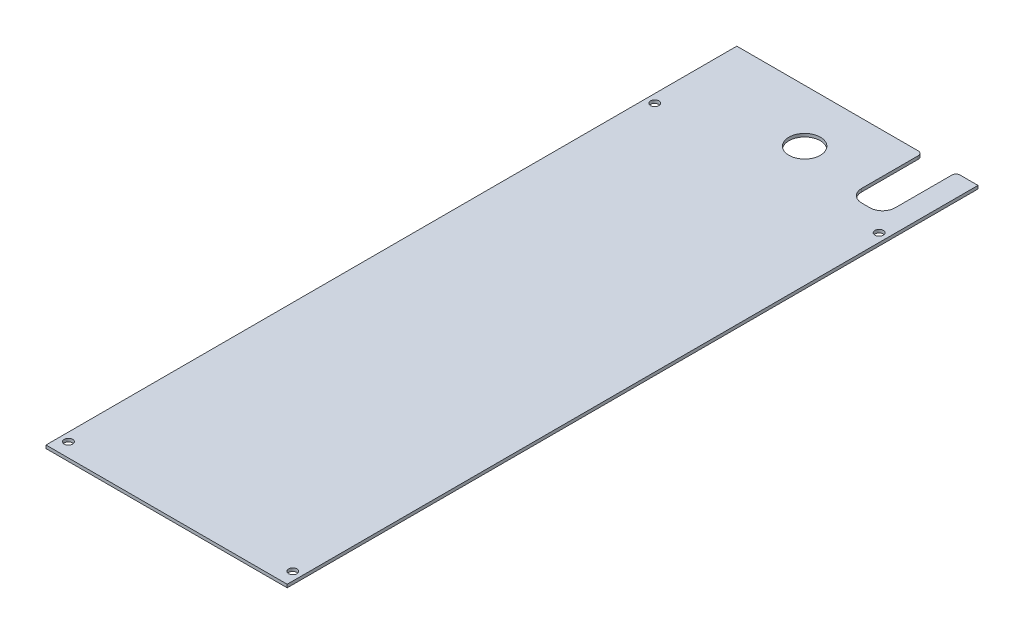
ISO-10303-21;
HEADER;
FILE_DESCRIPTION(('STEP AP214'),'2;1');
FILE_NAME('part.step','',(''),(''),'','','');
FILE_SCHEMA(('AUTOMOTIVE_DESIGN { 1 0 10303 214 1 1 1 1 }'));
ENDSEC;
DATA;
#1=APPLICATION_CONTEXT('core data for automotive mechanical design processes');
#2=APPLICATION_PROTOCOL_DEFINITION('international standard','automotive_design',2000,#1);
#3=PRODUCT_CONTEXT('',#1,'mechanical');
#4=PRODUCT('Part','Part','',(#3));
#5=PRODUCT_RELATED_PRODUCT_CATEGORY('part','',(#4));
#6=PRODUCT_DEFINITION_FORMATION('','',#4);
#7=PRODUCT_DEFINITION_CONTEXT('part definition',#1,'design');
#8=PRODUCT_DEFINITION('design','',#6,#7);
#9=PRODUCT_DEFINITION_SHAPE('','',#8);
#10=(LENGTH_UNIT() NAMED_UNIT(*) SI_UNIT(.MILLI.,.METRE.));
#11=(NAMED_UNIT(*) PLANE_ANGLE_UNIT() SI_UNIT($,.RADIAN.));
#12=(NAMED_UNIT(*) SI_UNIT($,.STERADIAN.) SOLID_ANGLE_UNIT());
#13=UNCERTAINTY_MEASURE_WITH_UNIT(LENGTH_MEASURE(1.E-05),#10,'distance_accuracy_value','');
#14=(GEOMETRIC_REPRESENTATION_CONTEXT(3) GLOBAL_UNCERTAINTY_ASSIGNED_CONTEXT((#13)) GLOBAL_UNIT_ASSIGNED_CONTEXT((#10,
#11,#12)) REPRESENTATION_CONTEXT('',''));
#15=CARTESIAN_POINT('',(0.,0.,0.));
#16=DIRECTION('',(0.,0.,1.));
#17=DIRECTION('',(1.,0.,0.));
#18=AXIS2_PLACEMENT_3D('',#15,#16,#17);
#19=CARTESIAN_POINT('',(-57.5,-1.5,-121.41));
#20=DIRECTION('',(0.,0.,-1.));
#21=DIRECTION('',(-1.,0.,0.));
#22=AXIS2_PLACEMENT_3D('',#19,#20,#21);
#23=PLANE('',#22);
#24=DIRECTION('',(-1.,0.,0.));
#25=VECTOR('',#24,1.);
#26=CARTESIAN_POINT('',(-57.5,0.,-121.41));
#27=LINE('',#26,#25);
#28=CARTESIAN_POINT('',(29.,0.,-121.41));
#29=VERTEX_POINT('',#28);
#30=CARTESIAN_POINT('',(-57.5,0.,-121.41));
#31=VERTEX_POINT('',#30);
#32=EDGE_CURVE('E188',#29,#31,#27,.T.);
#33=ORIENTED_EDGE('',*,*,#32,.F.);
#34=DIRECTION('',(0.,1.,0.));
#35=VECTOR('',#34,1.);
#36=CARTESIAN_POINT('',(29.,-1.5,-121.41));
#37=LINE('',#36,#35);
#38=CARTESIAN_POINT('',(29.,-1.5,-121.41));
#39=VERTEX_POINT('',#38);
#40=EDGE_CURVE('E13',#29,#39,#37,.F.);
#41=ORIENTED_EDGE('',*,*,#40,.T.);
#42=DIRECTION('',(-1.,0.,0.));
#43=VECTOR('',#42,1.);
#44=CARTESIAN_POINT('',(-57.5,-1.5,-121.41));
#45=LINE('',#44,#43);
#46=CARTESIAN_POINT('',(-57.5,-1.5,-121.41));
#47=VERTEX_POINT('',#46);
#48=EDGE_CURVE('E170',#39,#47,#45,.T.);
#49=ORIENTED_EDGE('',*,*,#48,.T.);
#50=DIRECTION('',(0.,1.,0.));
#51=VECTOR('',#50,1.);
#52=CARTESIAN_POINT('',(-57.5,-1.5,-121.41));
#53=LINE('',#52,#51);
#54=EDGE_CURVE('E157',#47,#31,#53,.T.);
#55=ORIENTED_EDGE('',*,*,#54,.T.);
#56=EDGE_LOOP('',(#33,#41,#49,#55));
#57=FACE_BOUND('',#56,.T.);
#58=ADVANCED_FACE('F57',(#57),#23,.T.);
#59=CARTESIAN_POINT('',(57.5,-1.5,207.99));
#60=DIRECTION('',(1.,0.,0.));
#61=DIRECTION('',(0.,0.,-1.));
#62=AXIS2_PLACEMENT_3D('',#59,#60,#61);
#63=PLANE('',#62);
#64=DIRECTION('',(0.,0.,-1.));
#65=VECTOR('',#64,1.);
#66=CARTESIAN_POINT('',(57.5,0.,207.99));
#67=LINE('',#66,#65);
#68=CARTESIAN_POINT('',(57.5,0.,207.99));
#69=VERTEX_POINT('',#68);
#70=CARTESIAN_POINT('',(57.5,0.,-121.41));
#71=VERTEX_POINT('',#70);
#72=EDGE_CURVE('E186',#69,#71,#67,.T.);
#73=ORIENTED_EDGE('',*,*,#72,.F.);
#74=DIRECTION('',(0.,1.,0.));
#75=VECTOR('',#74,1.);
#76=CARTESIAN_POINT('',(57.5,-1.5,207.99));
#77=LINE('',#76,#75);
#78=CARTESIAN_POINT('',(57.5,-1.5,207.99));
#79=VERTEX_POINT('',#78);
#80=EDGE_CURVE('E173',#79,#69,#77,.T.);
#81=ORIENTED_EDGE('',*,*,#80,.F.);
#82=DIRECTION('',(0.,0.,-1.));
#83=VECTOR('',#82,1.);
#84=CARTESIAN_POINT('',(57.5,-1.5,207.99));
#85=LINE('',#84,#83);
#86=CARTESIAN_POINT('',(57.5,-1.5,-121.41));
#87=VERTEX_POINT('',#86);
#88=EDGE_CURVE('E165',#79,#87,#85,.T.);
#89=ORIENTED_EDGE('',*,*,#88,.T.);
#90=DIRECTION('',(0.,1.,0.));
#91=VECTOR('',#90,1.);
#92=CARTESIAN_POINT('',(57.5,-1.5,-121.41));
#93=LINE('',#92,#91);
#94=EDGE_CURVE('E145',#87,#71,#93,.T.);
#95=ORIENTED_EDGE('',*,*,#94,.T.);
#96=EDGE_LOOP('',(#73,#81,#89,#95));
#97=FACE_BOUND('',#96,.T.);
#98=ADVANCED_FACE('F172',(#97),#63,.T.);
#99=CARTESIAN_POINT('',(-57.5,-1.5,207.99));
#100=DIRECTION('',(0.,0.,1.));
#101=DIRECTION('',(1.,0.,0.));
#102=AXIS2_PLACEMENT_3D('',#99,#100,#101);
#103=PLANE('',#102);
#104=DIRECTION('',(1.,0.,0.));
#105=VECTOR('',#104,1.);
#106=CARTESIAN_POINT('',(-57.5,0.,207.99));
#107=LINE('',#106,#105);
#108=CARTESIAN_POINT('',(-57.5,0.,207.99));
#109=VERTEX_POINT('',#108);
#110=EDGE_CURVE('E174',#109,#69,#107,.T.);
#111=ORIENTED_EDGE('',*,*,#110,.F.);
#112=DIRECTION('',(0.,1.,0.));
#113=VECTOR('',#112,1.);
#114=CARTESIAN_POINT('',(-57.5,-1.5,207.99));
#115=LINE('',#114,#113);
#116=CARTESIAN_POINT('',(-57.5,-1.5,207.99));
#117=VERTEX_POINT('',#116);
#118=EDGE_CURVE('E195',#117,#109,#115,.T.);
#119=ORIENTED_EDGE('',*,*,#118,.F.);
#120=DIRECTION('',(1.,0.,0.));
#121=VECTOR('',#120,1.);
#122=CARTESIAN_POINT('',(-57.5,-1.5,207.99));
#123=LINE('',#122,#121);
#124=EDGE_CURVE('E158',#117,#79,#123,.T.);
#125=ORIENTED_EDGE('',*,*,#124,.T.);
#126=ORIENTED_EDGE('',*,*,#80,.T.);
#127=EDGE_LOOP('',(#111,#119,#125,#126));
#128=FACE_BOUND('',#127,.T.);
#129=ADVANCED_FACE('F299',(#128),#103,.T.);
#130=CARTESIAN_POINT('',(-57.5,-1.5,207.99));
#131=DIRECTION('',(-1.,0.,0.));
#132=DIRECTION('',(0.,0.,1.));
#133=AXIS2_PLACEMENT_3D('',#130,#131,#132);
#134=PLANE('',#133);
#135=DIRECTION('',(0.,0.,1.));
#136=VECTOR('',#135,1.);
#137=CARTESIAN_POINT('',(-57.5,0.,207.99));
#138=LINE('',#137,#136);
#139=EDGE_CURVE('E177',#31,#109,#138,.T.);
#140=ORIENTED_EDGE('',*,*,#139,.F.);
#141=ORIENTED_EDGE('',*,*,#54,.F.);
#142=DIRECTION('',(0.,0.,1.));
#143=VECTOR('',#142,1.);
#144=CARTESIAN_POINT('',(-57.5,-1.5,207.99));
#145=LINE('',#144,#143);
#146=EDGE_CURVE('E169',#47,#117,#145,.T.);
#147=ORIENTED_EDGE('',*,*,#146,.T.);
#148=ORIENTED_EDGE('',*,*,#118,.T.);
#149=EDGE_LOOP('',(#140,#141,#147,#148));
#150=FACE_BOUND('',#149,.T.);
#151=ADVANCED_FACE('F303',(#150),#134,.T.);
#152=CARTESIAN_POINT('',(49.,-1.5,-121.41));
#153=VERTEX_POINT('',#152);
#154=EDGE_CURVE('E149',#87,#153,#45,.T.);
#155=ORIENTED_EDGE('',*,*,#154,.T.);
#156=DIRECTION('',(0.,1.,0.));
#157=VECTOR('',#156,1.);
#158=CARTESIAN_POINT('',(49.,0.,-121.41));
#159=LINE('',#158,#157);
#160=CARTESIAN_POINT('',(49.,0.,-121.41));
#161=VERTEX_POINT('',#160);
#162=EDGE_CURVE('E218',#153,#161,#159,.T.);
#163=ORIENTED_EDGE('',*,*,#162,.T.);
#164=EDGE_CURVE('E152',#71,#161,#27,.T.);
#165=ORIENTED_EDGE('',*,*,#164,.F.);
#166=ORIENTED_EDGE('',*,*,#94,.F.);
#167=EDGE_LOOP('',(#155,#163,#165,#166));
#168=FACE_BOUND('',#167,.T.);
#169=ADVANCED_FACE('F147',(#168),#23,.T.);
#170=CARTESIAN_POINT('',(0.,-1.5,0.));
#171=DIRECTION('',(0.,-1.,0.));
#172=DIRECTION('',(0.,0.,-1.));
#173=AXIS2_PLACEMENT_3D('',#170,#171,#172);
#174=PLANE('',#173);
#175=DIRECTION('',(0.,0.,-1.));
#176=VECTOR('',#175,1.);
#177=CARTESIAN_POINT('',(47.,-1.5,-121.41));
#178=LINE('',#177,#176);
#179=CARTESIAN_POINT('',(47.,-1.5,-92.41));
#180=VERTEX_POINT('',#179);
#181=CARTESIAN_POINT('',(47.,-1.5,-119.41));
#182=VERTEX_POINT('',#181);
#183=EDGE_CURVE('E245',#180,#182,#178,.T.);
#184=ORIENTED_EDGE('',*,*,#183,.T.);
#185=CARTESIAN_POINT('',(49.,-1.5,-119.41));
#186=DIRECTION('',(0.,-1.,0.));
#187=DIRECTION('',(0.,0.,-1.));
#188=AXIS2_PLACEMENT_3D('',#185,#186,#187);
#189=CIRCLE('',#188,2.);
#190=EDGE_CURVE('E168',#182,#153,#189,.T.);
#191=ORIENTED_EDGE('',*,*,#190,.T.);
#192=ORIENTED_EDGE('',*,*,#154,.F.);
#193=ORIENTED_EDGE('',*,*,#88,.F.);
#194=ORIENTED_EDGE('',*,*,#124,.F.);
#195=ORIENTED_EDGE('',*,*,#146,.F.);
#196=ORIENTED_EDGE('',*,*,#48,.F.);
#197=CARTESIAN_POINT('',(29.,-1.5,-119.41));
#198=DIRECTION('',(0.,-1.,0.));
#199=DIRECTION('',(0.,0.,-1.));
#200=AXIS2_PLACEMENT_3D('',#197,#198,#199);
#201=CIRCLE('',#200,2.);
#202=CARTESIAN_POINT('',(31.,-1.5,-119.41));
#203=VERTEX_POINT('',#202);
#204=EDGE_CURVE('E77',#39,#203,#201,.T.);
#205=ORIENTED_EDGE('',*,*,#204,.T.);
#206=DIRECTION('',(0.,0.,1.));
#207=VECTOR('',#206,1.);
#208=CARTESIAN_POINT('',(31.,-1.5,-121.41));
#209=LINE('',#208,#207);
#210=CARTESIAN_POINT('',(31.,-1.5,-92.41));
#211=VERTEX_POINT('',#210);
#212=EDGE_CURVE('E233',#203,#211,#209,.T.);
#213=ORIENTED_EDGE('',*,*,#212,.T.);
#214=CARTESIAN_POINT('',(37.,-1.5,-92.41));
#215=DIRECTION('',(0.,-1.,0.));
#216=DIRECTION('',(0.,0.,-1.));
#217=AXIS2_PLACEMENT_3D('',#214,#215,#216);
#218=CIRCLE('',#217,6.);
#219=CARTESIAN_POINT('',(37.,-1.5,-86.41));
#220=VERTEX_POINT('',#219);
#221=EDGE_CURVE('E216',#211,#220,#218,.F.);
#222=ORIENTED_EDGE('',*,*,#221,.T.);
#223=DIRECTION('',(1.,0.,0.));
#224=VECTOR('',#223,1.);
#225=CARTESIAN_POINT('',(31.,-1.5,-86.41));
#226=LINE('',#225,#224);
#227=CARTESIAN_POINT('',(41.,-1.5,-86.41));
#228=VERTEX_POINT('',#227);
#229=EDGE_CURVE('E348',#220,#228,#226,.T.);
#230=ORIENTED_EDGE('',*,*,#229,.T.);
#231=CARTESIAN_POINT('',(41.,-1.5,-92.41));
#232=DIRECTION('',(0.,-1.,0.));
#233=DIRECTION('',(0.,0.,-1.));
#234=AXIS2_PLACEMENT_3D('',#231,#232,#233);
#235=CIRCLE('',#234,6.);
#236=EDGE_CURVE('E211',#228,#180,#235,.F.);
#237=ORIENTED_EDGE('',*,*,#236,.T.);
#238=EDGE_LOOP('',(#184,#191,#192,#193,#194,#195,#196,#205,#213,#222,#230,#237));
#239=FACE_BOUND('',#238,.T.);
#240=CARTESIAN_POINT('',(0.,-1.5,-96.25));
#241=DIRECTION('',(0.,-1.,0.));
#242=DIRECTION('',(0.,0.,-1.));
#243=AXIS2_PLACEMENT_3D('',#240,#241,#242);
#244=CIRCLE('',#243,7.5);
#245=CARTESIAN_POINT('',(0.,-1.5,-103.75));
#246=VERTEX_POINT('',#245);
#247=EDGE_CURVE('E254',#246,#246,#244,.F.);
#248=ORIENTED_EDGE('',*,*,#247,.T.);
#249=EDGE_LOOP('',(#248));
#250=FACE_BOUND('',#249,.T.);
#251=CARTESIAN_POINT('',(53.5000000000001,-1.5,201.3));
#252=DIRECTION('',(0.,-1.,0.));
#253=DIRECTION('',(0.,0.,-1.));
#254=AXIS2_PLACEMENT_3D('',#251,#252,#253);
#255=CIRCLE('',#254,2.);
#256=CARTESIAN_POINT('',(53.5000000000001,-1.5,199.3));
#257=VERTEX_POINT('',#256);
#258=EDGE_CURVE('E253',#257,#257,#255,.F.);
#259=ORIENTED_EDGE('',*,*,#258,.T.);
#260=EDGE_LOOP('',(#259));
#261=FACE_BOUND('',#260,.T.);
#262=CARTESIAN_POINT('',(53.5,-1.5,-78.2599999999999));
#263=DIRECTION('',(0.,-1.,0.));
#264=DIRECTION('',(0.,0.,-1.));
#265=AXIS2_PLACEMENT_3D('',#262,#263,#264);
#266=CIRCLE('',#265,2.);
#267=CARTESIAN_POINT('',(53.5,-1.5,-80.26));
#268=VERTEX_POINT('',#267);
#269=EDGE_CURVE('E260',#268,#268,#266,.F.);
#270=ORIENTED_EDGE('',*,*,#269,.T.);
#271=EDGE_LOOP('',(#270));
#272=FACE_BOUND('',#271,.T.);
#273=CARTESIAN_POINT('',(-53.5,-1.5,-78.2599999999999));
#274=DIRECTION('',(0.,-1.,0.));
#275=DIRECTION('',(0.,0.,-1.));
#276=AXIS2_PLACEMENT_3D('',#273,#274,#275);
#277=CIRCLE('',#276,2.);
#278=CARTESIAN_POINT('',(-53.5,-1.5,-80.2599999999999));
#279=VERTEX_POINT('',#278);
#280=EDGE_CURVE('E266',#279,#279,#277,.F.);
#281=ORIENTED_EDGE('',*,*,#280,.T.);
#282=EDGE_LOOP('',(#281));
#283=FACE_BOUND('',#282,.T.);
#284=CARTESIAN_POINT('',(-53.5,-1.5,201.3));
#285=DIRECTION('',(0.,-1.,0.));
#286=DIRECTION('',(0.,0.,-1.));
#287=AXIS2_PLACEMENT_3D('',#284,#285,#286);
#288=CIRCLE('',#287,2.);
#289=CARTESIAN_POINT('',(-53.5,-1.5,199.3));
#290=VERTEX_POINT('',#289);
#291=EDGE_CURVE('E180',#290,#290,#288,.F.);
#292=ORIENTED_EDGE('',*,*,#291,.T.);
#293=EDGE_LOOP('',(#292));
#294=FACE_BOUND('',#293,.T.);
#295=ADVANCED_FACE('F162',(#239,#250,#261,#272,#283,#294),#174,.T.);
#296=CARTESIAN_POINT('',(0.,0.,0.));
#297=DIRECTION('',(0.,-1.,0.));
#298=DIRECTION('',(0.,0.,-1.));
#299=AXIS2_PLACEMENT_3D('',#296,#297,#298);
#300=PLANE('',#299);
#301=CARTESIAN_POINT('',(0.,0.,-96.25));
#302=DIRECTION('',(0.,1.,0.));
#303=DIRECTION('',(0.,0.,1.));
#304=AXIS2_PLACEMENT_3D('',#301,#302,#303);
#305=CIRCLE('',#304,7.5);
#306=CARTESIAN_POINT('',(0.,0.,-88.75));
#307=VERTEX_POINT('',#306);
#308=EDGE_CURVE('E250',#307,#307,#305,.T.);
#309=ORIENTED_EDGE('',*,*,#308,.F.);
#310=EDGE_LOOP('',(#309));
#311=FACE_BOUND('',#310,.T.);
#312=CARTESIAN_POINT('',(53.5000000000001,0.,201.3));
#313=DIRECTION('',(0.,1.,0.));
#314=DIRECTION('',(0.,0.,-1.));
#315=AXIS2_PLACEMENT_3D('',#312,#313,#314);
#316=CIRCLE('',#315,2.);
#317=CARTESIAN_POINT('',(53.5000000000001,0.,199.3));
#318=VERTEX_POINT('',#317);
#319=EDGE_CURVE('E257',#318,#318,#316,.T.);
#320=ORIENTED_EDGE('',*,*,#319,.F.);
#321=EDGE_LOOP('',(#320));
#322=FACE_BOUND('',#321,.T.);
#323=CARTESIAN_POINT('',(53.5,0.,-78.2599999999999));
#324=DIRECTION('',(0.,1.,0.));
#325=DIRECTION('',(0.,0.,-1.));
#326=AXIS2_PLACEMENT_3D('',#323,#324,#325);
#327=CIRCLE('',#326,2.);
#328=CARTESIAN_POINT('',(53.5,0.,-80.26));
#329=VERTEX_POINT('',#328);
#330=EDGE_CURVE('E263',#329,#329,#327,.T.);
#331=ORIENTED_EDGE('',*,*,#330,.F.);
#332=EDGE_LOOP('',(#331));
#333=FACE_BOUND('',#332,.T.);
#334=CARTESIAN_POINT('',(-53.5,0.,-78.2599999999999));
#335=DIRECTION('',(0.,1.,0.));
#336=DIRECTION('',(0.,0.,1.));
#337=AXIS2_PLACEMENT_3D('',#334,#335,#336);
#338=CIRCLE('',#337,2.);
#339=CARTESIAN_POINT('',(-53.5,0.,-76.2599999999999));
#340=VERTEX_POINT('',#339);
#341=EDGE_CURVE('E269',#340,#340,#338,.T.);
#342=ORIENTED_EDGE('',*,*,#341,.F.);
#343=EDGE_LOOP('',(#342));
#344=FACE_BOUND('',#343,.T.);
#345=CARTESIAN_POINT('',(-53.5,0.,201.3));
#346=DIRECTION('',(0.,1.,0.));
#347=DIRECTION('',(0.,0.,1.));
#348=AXIS2_PLACEMENT_3D('',#345,#346,#347);
#349=CIRCLE('',#348,2.);
#350=CARTESIAN_POINT('',(-53.5,0.,203.3));
#351=VERTEX_POINT('',#350);
#352=EDGE_CURVE('E189',#351,#351,#349,.T.);
#353=ORIENTED_EDGE('',*,*,#352,.F.);
#354=EDGE_LOOP('',(#353));
#355=FACE_BOUND('',#354,.T.);
#356=ORIENTED_EDGE('',*,*,#164,.T.);
#357=CARTESIAN_POINT('',(49.,0.,-119.41));
#358=DIRECTION('',(0.,-1.,0.));
#359=DIRECTION('',(0.,0.,-1.));
#360=AXIS2_PLACEMENT_3D('',#357,#358,#359);
#361=CIRCLE('',#360,2.);
#362=CARTESIAN_POINT('',(47.,0.,-119.41));
#363=VERTEX_POINT('',#362);
#364=EDGE_CURVE('E222',#161,#363,#361,.F.);
#365=ORIENTED_EDGE('',*,*,#364,.T.);
#366=DIRECTION('',(0.,0.,-1.));
#367=VECTOR('',#366,1.);
#368=CARTESIAN_POINT('',(47.,0.,-121.41));
#369=LINE('',#368,#367);
#370=CARTESIAN_POINT('',(47.,0.,-92.41));
#371=VERTEX_POINT('',#370);
#372=EDGE_CURVE('E242',#371,#363,#369,.T.);
#373=ORIENTED_EDGE('',*,*,#372,.F.);
#374=CARTESIAN_POINT('',(41.,0.,-92.41));
#375=DIRECTION('',(0.,-1.,0.));
#376=DIRECTION('',(0.,0.,-1.));
#377=AXIS2_PLACEMENT_3D('',#374,#375,#376);
#378=CIRCLE('',#377,6.);
#379=CARTESIAN_POINT('',(41.,0.,-86.41));
#380=VERTEX_POINT('',#379);
#381=EDGE_CURVE('E209',#371,#380,#378,.T.);
#382=ORIENTED_EDGE('',*,*,#381,.T.);
#383=DIRECTION('',(1.,0.,0.));
#384=VECTOR('',#383,1.);
#385=CARTESIAN_POINT('',(31.,0.,-86.41));
#386=LINE('',#385,#384);
#387=CARTESIAN_POINT('',(37.,0.,-86.41));
#388=VERTEX_POINT('',#387);
#389=EDGE_CURVE('E239',#388,#380,#386,.T.);
#390=ORIENTED_EDGE('',*,*,#389,.F.);
#391=CARTESIAN_POINT('',(37.,0.,-92.41));
#392=DIRECTION('',(0.,-1.,0.));
#393=DIRECTION('',(0.,0.,-1.));
#394=AXIS2_PLACEMENT_3D('',#391,#392,#393);
#395=CIRCLE('',#394,6.);
#396=CARTESIAN_POINT('',(31.,0.,-92.41));
#397=VERTEX_POINT('',#396);
#398=EDGE_CURVE('E213',#388,#397,#395,.T.);
#399=ORIENTED_EDGE('',*,*,#398,.T.);
#400=DIRECTION('',(0.,0.,1.));
#401=VECTOR('',#400,1.);
#402=CARTESIAN_POINT('',(31.,0.,-121.41));
#403=LINE('',#402,#401);
#404=CARTESIAN_POINT('',(31.,0.,-119.41));
#405=VERTEX_POINT('',#404);
#406=EDGE_CURVE('E232',#405,#397,#403,.T.);
#407=ORIENTED_EDGE('',*,*,#406,.F.);
#408=CARTESIAN_POINT('',(29.,0.,-119.41));
#409=DIRECTION('',(0.,-1.,0.));
#410=DIRECTION('',(0.,0.,-1.));
#411=AXIS2_PLACEMENT_3D('',#408,#409,#410);
#412=CIRCLE('',#411,2.);
#413=EDGE_CURVE('E220',#405,#29,#412,.F.);
#414=ORIENTED_EDGE('',*,*,#413,.T.);
#415=ORIENTED_EDGE('',*,*,#32,.T.);
#416=ORIENTED_EDGE('',*,*,#139,.T.);
#417=ORIENTED_EDGE('',*,*,#110,.T.);
#418=ORIENTED_EDGE('',*,*,#72,.T.);
#419=EDGE_LOOP('',(#356,#365,#373,#382,#390,#399,#407,#414,#415,#416,#417,#418));
#420=FACE_BOUND('',#419,.T.);
#421=ADVANCED_FACE('F236',(#311,#322,#333,#344,#355,#420),#300,.F.);
#422=CARTESIAN_POINT('',(-53.5,-1.501,201.3));
#423=DIRECTION('',(0.,1.,0.));
#424=DIRECTION('',(0.,0.,1.));
#425=AXIS2_PLACEMENT_3D('',#422,#423,#424);
#426=CYLINDRICAL_SURFACE('',#425,2.);
#427=ORIENTED_EDGE('',*,*,#291,.F.);
#428=EDGE_LOOP('',(#427));
#429=FACE_BOUND('',#428,.T.);
#430=ORIENTED_EDGE('',*,*,#352,.T.);
#431=EDGE_LOOP('',(#430));
#432=FACE_BOUND('',#431,.T.);
#433=ADVANCED_FACE('F280',(#429,#432),#426,.F.);
#434=CARTESIAN_POINT('',(-53.5,-1.501,-78.2599999999999));
#435=DIRECTION('',(0.,1.,0.));
#436=DIRECTION('',(0.,0.,1.));
#437=AXIS2_PLACEMENT_3D('',#434,#435,#436);
#438=CYLINDRICAL_SURFACE('',#437,2.);
#439=ORIENTED_EDGE('',*,*,#280,.F.);
#440=EDGE_LOOP('',(#439));
#441=FACE_BOUND('',#440,.T.);
#442=ORIENTED_EDGE('',*,*,#341,.T.);
#443=EDGE_LOOP('',(#442));
#444=FACE_BOUND('',#443,.T.);
#445=ADVANCED_FACE('F282',(#441,#444),#438,.F.);
#446=CARTESIAN_POINT('',(53.5,-1.501,-78.2599999999999));
#447=DIRECTION('',(0.,1.,0.));
#448=DIRECTION('',(0.,0.,1.));
#449=AXIS2_PLACEMENT_3D('',#446,#447,#448);
#450=CYLINDRICAL_SURFACE('',#449,2.);
#451=ORIENTED_EDGE('',*,*,#269,.F.);
#452=EDGE_LOOP('',(#451));
#453=FACE_BOUND('',#452,.T.);
#454=ORIENTED_EDGE('',*,*,#330,.T.);
#455=EDGE_LOOP('',(#454));
#456=FACE_BOUND('',#455,.T.);
#457=ADVANCED_FACE('F288',(#453,#456),#450,.F.);
#458=CARTESIAN_POINT('',(53.5000000000001,-1.501,201.3));
#459=DIRECTION('',(0.,1.,0.));
#460=DIRECTION('',(0.,0.,1.));
#461=AXIS2_PLACEMENT_3D('',#458,#459,#460);
#462=CYLINDRICAL_SURFACE('',#461,2.);
#463=ORIENTED_EDGE('',*,*,#258,.F.);
#464=EDGE_LOOP('',(#463));
#465=FACE_BOUND('',#464,.T.);
#466=ORIENTED_EDGE('',*,*,#319,.T.);
#467=EDGE_LOOP('',(#466));
#468=FACE_BOUND('',#467,.T.);
#469=ADVANCED_FACE('F362',(#465,#468),#462,.F.);
#470=CARTESIAN_POINT('',(0.,-1.501,-96.25));
#471=DIRECTION('',(0.,1.,0.));
#472=DIRECTION('',(0.,0.,1.));
#473=AXIS2_PLACEMENT_3D('',#470,#471,#472);
#474=CYLINDRICAL_SURFACE('',#473,7.5);
#475=ORIENTED_EDGE('',*,*,#247,.F.);
#476=EDGE_LOOP('',(#475));
#477=FACE_BOUND('',#476,.T.);
#478=ORIENTED_EDGE('',*,*,#308,.T.);
#479=EDGE_LOOP('',(#478));
#480=FACE_BOUND('',#479,.T.);
#481=ADVANCED_FACE('F359',(#477,#480),#474,.F.);
#482=CARTESIAN_POINT('',(31.,-1.5,-121.41));
#483=DIRECTION('',(-1.,0.,0.));
#484=DIRECTION('',(0.,0.,1.));
#485=AXIS2_PLACEMENT_3D('',#482,#483,#484);
#486=PLANE('',#485);
#487=ORIENTED_EDGE('',*,*,#212,.F.);
#488=DIRECTION('',(0.,1.,0.));
#489=VECTOR('',#488,1.);
#490=CARTESIAN_POINT('',(31.,0.,-119.41));
#491=LINE('',#490,#489);
#492=EDGE_CURVE('E65',#203,#405,#491,.T.);
#493=ORIENTED_EDGE('',*,*,#492,.T.);
#494=ORIENTED_EDGE('',*,*,#406,.T.);
#495=DIRECTION('',(0.,1.,0.));
#496=VECTOR('',#495,1.);
#497=CARTESIAN_POINT('',(31.,-1.5,-92.41));
#498=LINE('',#497,#496);
#499=EDGE_CURVE('E206',#397,#211,#498,.F.);
#500=ORIENTED_EDGE('',*,*,#499,.T.);
#501=EDGE_LOOP('',(#487,#493,#494,#500));
#502=FACE_BOUND('',#501,.T.);
#503=ADVANCED_FACE('F231',(#502),#486,.F.);
#504=CARTESIAN_POINT('',(47.,-1.5,-121.41));
#505=DIRECTION('',(1.,0.,0.));
#506=DIRECTION('',(0.,0.,-1.));
#507=AXIS2_PLACEMENT_3D('',#504,#505,#506);
#508=PLANE('',#507);
#509=ORIENTED_EDGE('',*,*,#372,.T.);
#510=DIRECTION('',(0.,1.,0.));
#511=VECTOR('',#510,1.);
#512=CARTESIAN_POINT('',(47.,-1.5,-119.41));
#513=LINE('',#512,#511);
#514=EDGE_CURVE('E224',#363,#182,#513,.F.);
#515=ORIENTED_EDGE('',*,*,#514,.T.);
#516=ORIENTED_EDGE('',*,*,#183,.F.);
#517=DIRECTION('',(0.,1.,0.));
#518=VECTOR('',#517,1.);
#519=CARTESIAN_POINT('',(47.,0.,-92.41));
#520=LINE('',#519,#518);
#521=EDGE_CURVE('E194',#180,#371,#520,.T.);
#522=ORIENTED_EDGE('',*,*,#521,.T.);
#523=EDGE_LOOP('',(#509,#515,#516,#522));
#524=FACE_BOUND('',#523,.T.);
#525=ADVANCED_FACE('F322',(#524),#508,.F.);
#526=CARTESIAN_POINT('',(31.,-1.5,-86.41));
#527=DIRECTION('',(0.,0.,1.));
#528=DIRECTION('',(1.,0.,0.));
#529=AXIS2_PLACEMENT_3D('',#526,#527,#528);
#530=PLANE('',#529);
#531=ORIENTED_EDGE('',*,*,#389,.T.);
#532=DIRECTION('',(0.,1.,0.));
#533=VECTOR('',#532,1.);
#534=CARTESIAN_POINT('',(41.,-1.5,-86.41));
#535=LINE('',#534,#533);
#536=EDGE_CURVE('E204',#380,#228,#535,.F.);
#537=ORIENTED_EDGE('',*,*,#536,.T.);
#538=ORIENTED_EDGE('',*,*,#229,.F.);
#539=DIRECTION('',(0.,1.,0.));
#540=VECTOR('',#539,1.);
#541=CARTESIAN_POINT('',(37.,0.,-86.41));
#542=LINE('',#541,#540);
#543=EDGE_CURVE('E201',#220,#388,#542,.T.);
#544=ORIENTED_EDGE('',*,*,#543,.T.);
#545=EDGE_LOOP('',(#531,#537,#538,#544));
#546=FACE_BOUND('',#545,.T.);
#547=ADVANCED_FACE('F337',(#546),#530,.F.);
#548=CARTESIAN_POINT('',(41.,-1.5,-92.41));
#549=DIRECTION('',(0.,-1.,0.));
#550=DIRECTION('',(0.,0.,-1.));
#551=AXIS2_PLACEMENT_3D('',#548,#549,#550);
#552=CYLINDRICAL_SURFACE('',#551,6.);
#553=ORIENTED_EDGE('',*,*,#236,.F.);
#554=ORIENTED_EDGE('',*,*,#536,.F.);
#555=ORIENTED_EDGE('',*,*,#381,.F.);
#556=ORIENTED_EDGE('',*,*,#521,.F.);
#557=EDGE_LOOP('',(#553,#554,#555,#556));
#558=FACE_BOUND('',#557,.T.);
#559=ADVANCED_FACE('F332',(#558),#552,.F.);
#560=CARTESIAN_POINT('',(37.,-1.5,-92.41));
#561=DIRECTION('',(0.,-1.,0.));
#562=DIRECTION('',(0.,0.,-1.));
#563=AXIS2_PLACEMENT_3D('',#560,#561,#562);
#564=CYLINDRICAL_SURFACE('',#563,6.);
#565=ORIENTED_EDGE('',*,*,#221,.F.);
#566=ORIENTED_EDGE('',*,*,#499,.F.);
#567=ORIENTED_EDGE('',*,*,#398,.F.);
#568=ORIENTED_EDGE('',*,*,#543,.F.);
#569=EDGE_LOOP('',(#565,#566,#567,#568));
#570=FACE_BOUND('',#569,.T.);
#571=ADVANCED_FACE('F327',(#570),#564,.F.);
#572=CARTESIAN_POINT('',(49.,-1.5,-119.41));
#573=DIRECTION('',(0.,-1.,0.));
#574=DIRECTION('',(0.,0.,-1.));
#575=AXIS2_PLACEMENT_3D('',#572,#573,#574);
#576=CYLINDRICAL_SURFACE('',#575,2.);
#577=ORIENTED_EDGE('',*,*,#190,.F.);
#578=ORIENTED_EDGE('',*,*,#514,.F.);
#579=ORIENTED_EDGE('',*,*,#364,.F.);
#580=ORIENTED_EDGE('',*,*,#162,.F.);
#581=EDGE_LOOP('',(#577,#578,#579,#580));
#582=FACE_BOUND('',#581,.T.);
#583=ADVANCED_FACE('F325',(#582),#576,.T.);
#584=CARTESIAN_POINT('',(29.,-1.5,-119.41));
#585=DIRECTION('',(0.,-1.,0.));
#586=DIRECTION('',(0.,0.,-1.));
#587=AXIS2_PLACEMENT_3D('',#584,#585,#586);
#588=CYLINDRICAL_SURFACE('',#587,2.);
#589=ORIENTED_EDGE('',*,*,#204,.F.);
#590=ORIENTED_EDGE('',*,*,#40,.F.);
#591=ORIENTED_EDGE('',*,*,#413,.F.);
#592=ORIENTED_EDGE('',*,*,#492,.F.);
#593=EDGE_LOOP('',(#589,#590,#591,#592));
#594=FACE_BOUND('',#593,.T.);
#595=ADVANCED_FACE('F59',(#594),#588,.T.);
#596=CLOSED_SHELL('',(#58,#98,#129,#151,#169,#295,#421,#433,#445,#457,#469,#481,#503,#525,#547,
#559,#571,#583,#595));
#597=MANIFOLD_SOLID_BREP('B2',#596);
#598=ADVANCED_BREP_SHAPE_REPRESENTATION('',(#18,#597),#14);
#599=SHAPE_DEFINITION_REPRESENTATION(#9,#598);
ENDSEC;
END-ISO-10303-21;
